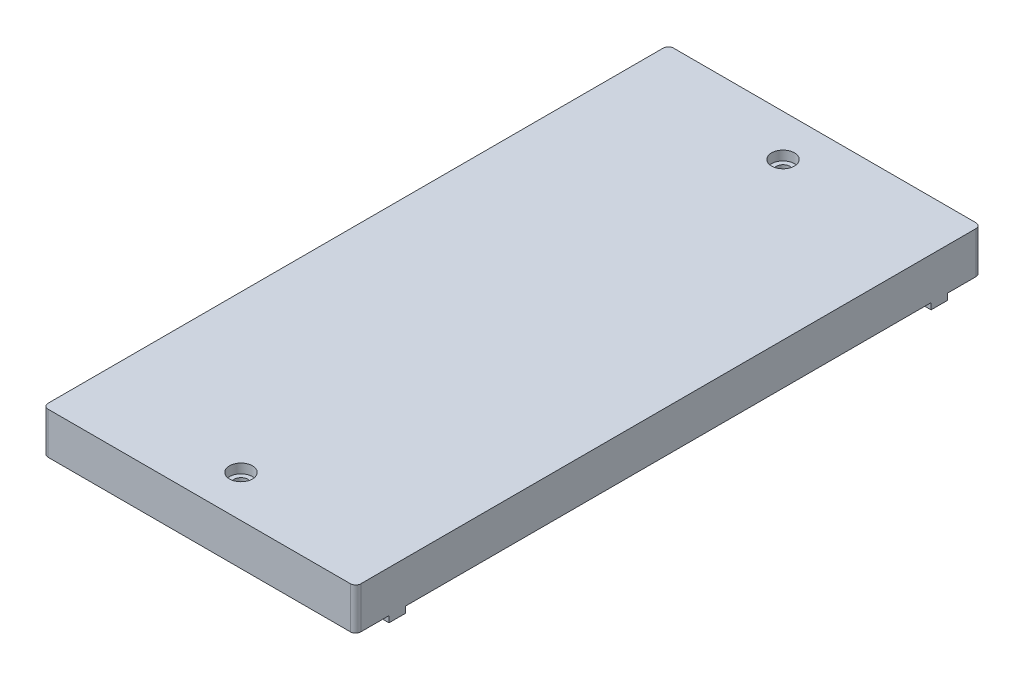
ISO-10303-21;
HEADER;
FILE_DESCRIPTION(('STEP AP214'),'2;1');
FILE_NAME('part.step','',(''),(''),'','','');
FILE_SCHEMA(('AUTOMOTIVE_DESIGN { 1 0 10303 214 1 1 1 1 }'));
ENDSEC;
DATA;
#1=APPLICATION_CONTEXT('core data for automotive mechanical design processes');
#2=APPLICATION_PROTOCOL_DEFINITION('international standard','automotive_design',2000,#1);
#3=PRODUCT_CONTEXT('',#1,'mechanical');
#4=PRODUCT('Part','Part','',(#3));
#5=PRODUCT_RELATED_PRODUCT_CATEGORY('part','',(#4));
#6=PRODUCT_DEFINITION_FORMATION('','',#4);
#7=PRODUCT_DEFINITION_CONTEXT('part definition',#1,'design');
#8=PRODUCT_DEFINITION('design','',#6,#7);
#9=PRODUCT_DEFINITION_SHAPE('','',#8);
#10=(LENGTH_UNIT() NAMED_UNIT(*) SI_UNIT(.MILLI.,.METRE.));
#11=(NAMED_UNIT(*) PLANE_ANGLE_UNIT() SI_UNIT($,.RADIAN.));
#12=(NAMED_UNIT(*) SI_UNIT($,.STERADIAN.) SOLID_ANGLE_UNIT());
#13=UNCERTAINTY_MEASURE_WITH_UNIT(LENGTH_MEASURE(1.E-05),#10,'distance_accuracy_value','');
#14=(GEOMETRIC_REPRESENTATION_CONTEXT(3) GLOBAL_UNCERTAINTY_ASSIGNED_CONTEXT((#13)) GLOBAL_UNIT_ASSIGNED_CONTEXT((#10,
#11,#12)) REPRESENTATION_CONTEXT('',''));
#15=CARTESIAN_POINT('',(0.,0.,0.));
#16=DIRECTION('',(0.,0.,1.));
#17=DIRECTION('',(1.,0.,0.));
#18=AXIS2_PLACEMENT_3D('',#15,#16,#17);
#19=CARTESIAN_POINT('',(0.,0.,0.));
#20=DIRECTION('',(0.,1.,0.));
#21=DIRECTION('',(0.,0.,1.));
#22=AXIS2_PLACEMENT_3D('',#19,#20,#21);
#23=PLANE('',#22);
#24=DIRECTION('',(0.,0.,1.));
#25=VECTOR('',#24,1.);
#26=CARTESIAN_POINT('',(-75.,0.,150.));
#27=LINE('',#26,#25);
#28=CARTESIAN_POINT('',(-75.,0.,-126.));
#29=VERTEX_POINT('',#28);
#30=CARTESIAN_POINT('',(-75.,0.,126.));
#31=VERTEX_POINT('',#30);
#32=EDGE_CURVE('E244',#29,#31,#27,.T.);
#33=ORIENTED_EDGE('',*,*,#32,.F.);
#34=DIRECTION('',(1.,0.,0.));
#35=VECTOR('',#34,1.);
#36=CARTESIAN_POINT('',(75.0000000000001,0.,-126.));
#37=LINE('',#36,#35);
#38=CARTESIAN_POINT('',(75.0000000000001,0.,-126.));
#39=VERTEX_POINT('',#38);
#40=EDGE_CURVE('E182',#29,#39,#37,.T.);
#41=ORIENTED_EDGE('',*,*,#40,.T.);
#42=DIRECTION('',(0.,0.,-1.));
#43=VECTOR('',#42,1.);
#44=CARTESIAN_POINT('',(75.0000000000001,0.,150.));
#45=LINE('',#44,#43);
#46=CARTESIAN_POINT('',(75.0000000000001,0.,126.));
#47=VERTEX_POINT('',#46);
#48=EDGE_CURVE('E249',#47,#39,#45,.T.);
#49=ORIENTED_EDGE('',*,*,#48,.F.);
#50=DIRECTION('',(-1.,0.,0.));
#51=VECTOR('',#50,1.);
#52=CARTESIAN_POINT('',(-75.,0.,126.));
#53=LINE('',#52,#51);
#54=EDGE_CURVE('E203',#47,#31,#53,.T.);
#55=ORIENTED_EDGE('',*,*,#54,.T.);
#56=EDGE_LOOP('',(#33,#41,#49,#55));
#57=FACE_BOUND('',#56,.T.);
#58=ADVANCED_FACE('F43',(#57),#23,.F.);
#59=DIRECTION('',(1.,0.,0.));
#60=VECTOR('',#59,1.);
#61=CARTESIAN_POINT('',(75.0000000000001,0.,150.));
#62=LINE('',#61,#60);
#63=CARTESIAN_POINT('',(-72.5,0.,150.));
#64=VERTEX_POINT('',#63);
#65=CARTESIAN_POINT('',(72.5000000000001,0.,150.));
#66=VERTEX_POINT('',#65);
#67=EDGE_CURVE('E243',#64,#66,#62,.T.);
#68=ORIENTED_EDGE('',*,*,#67,.F.);
#69=CARTESIAN_POINT('',(-72.5,0.,147.5));
#70=DIRECTION('',(0.,1.,0.));
#71=DIRECTION('',(0.,0.,1.));
#72=AXIS2_PLACEMENT_3D('',#69,#70,#71);
#73=CIRCLE('',#72,2.5);
#74=CARTESIAN_POINT('',(-75.,0.,147.5));
#75=VERTEX_POINT('',#74);
#76=EDGE_CURVE('E11',#64,#75,#73,.F.);
#77=ORIENTED_EDGE('',*,*,#76,.T.);
#78=CARTESIAN_POINT('',(-75.,0.,134.));
#79=VERTEX_POINT('',#78);
#80=EDGE_CURVE('E220',#79,#75,#27,.T.);
#81=ORIENTED_EDGE('',*,*,#80,.F.);
#82=DIRECTION('',(1.,0.,0.));
#83=VECTOR('',#82,1.);
#84=CARTESIAN_POINT('',(-75.,0.,134.));
#85=LINE('',#84,#83);
#86=CARTESIAN_POINT('',(75.0000000000001,0.,134.));
#87=VERTEX_POINT('',#86);
#88=EDGE_CURVE('E195',#79,#87,#85,.T.);
#89=ORIENTED_EDGE('',*,*,#88,.T.);
#90=CARTESIAN_POINT('',(75.0000000000001,0.,147.5));
#91=VERTEX_POINT('',#90);
#92=EDGE_CURVE('E247',#91,#87,#45,.T.);
#93=ORIENTED_EDGE('',*,*,#92,.F.);
#94=CARTESIAN_POINT('',(72.5000000000001,0.,147.5));
#95=DIRECTION('',(0.,1.,0.));
#96=DIRECTION('',(0.,0.,1.));
#97=AXIS2_PLACEMENT_3D('',#94,#95,#96);
#98=CIRCLE('',#97,2.5);
#99=EDGE_CURVE('E51',#91,#66,#98,.F.);
#100=ORIENTED_EDGE('',*,*,#99,.T.);
#101=EDGE_LOOP('',(#68,#77,#81,#89,#93,#100));
#102=FACE_BOUND('',#101,.T.);
#103=ADVANCED_FACE('F293',(#102),#23,.F.);
#104=CARTESIAN_POINT('',(-75.,20.,150.));
#105=DIRECTION('',(1.,0.,0.));
#106=DIRECTION('',(0.,0.,-1.));
#107=AXIS2_PLACEMENT_3D('',#104,#105,#106);
#108=PLANE('',#107);
#109=CARTESIAN_POINT('',(-75.,10.,0.));
#110=DIRECTION('',(-1.,0.,0.));
#111=DIRECTION('',(0.,0.,1.));
#112=AXIS2_PLACEMENT_3D('',#109,#110,#111);
#113=CIRCLE('',#112,3.39999999999999);
#114=CARTESIAN_POINT('',(-75.,10.,3.39999999999999));
#115=VERTEX_POINT('',#114);
#116=EDGE_CURVE('E418',#115,#115,#113,.T.);
#117=ORIENTED_EDGE('',*,*,#116,.F.);
#118=EDGE_LOOP('',(#117));
#119=FACE_BOUND('',#118,.T.);
#120=DIRECTION('',(0.,0.,1.));
#121=VECTOR('',#120,1.);
#122=CARTESIAN_POINT('',(-75.,20.,150.));
#123=LINE('',#122,#121);
#124=CARTESIAN_POINT('',(-75.,20.,-147.5));
#125=VERTEX_POINT('',#124);
#126=CARTESIAN_POINT('',(-75.,20.,147.5));
#127=VERTEX_POINT('',#126);
#128=EDGE_CURVE('E227',#125,#127,#123,.T.);
#129=ORIENTED_EDGE('',*,*,#128,.F.);
#130=DIRECTION('',(0.,-1.,0.));
#131=VECTOR('',#130,1.);
#132=CARTESIAN_POINT('',(-75.,20.,-147.5));
#133=LINE('',#132,#131);
#134=CARTESIAN_POINT('',(-75.,0.,-147.5));
#135=VERTEX_POINT('',#134);
#136=EDGE_CURVE('E282',#125,#135,#133,.T.);
#137=ORIENTED_EDGE('',*,*,#136,.T.);
#138=CARTESIAN_POINT('',(-75.,0.,-134.));
#139=VERTEX_POINT('',#138);
#140=EDGE_CURVE('E241',#135,#139,#27,.T.);
#141=ORIENTED_EDGE('',*,*,#140,.T.);
#142=DIRECTION('',(0.,1.,0.));
#143=VECTOR('',#142,1.);
#144=CARTESIAN_POINT('',(-75.,-3.,-134.));
#145=LINE('',#144,#143);
#146=CARTESIAN_POINT('',(-75.,-3.,-134.));
#147=VERTEX_POINT('',#146);
#148=EDGE_CURVE('E166',#147,#139,#145,.T.);
#149=ORIENTED_EDGE('',*,*,#148,.F.);
#150=DIRECTION('',(0.,0.,1.));
#151=VECTOR('',#150,1.);
#152=CARTESIAN_POINT('',(-75.,-3.,-134.));
#153=LINE('',#152,#151);
#154=CARTESIAN_POINT('',(-75.,-3.,-126.));
#155=VERTEX_POINT('',#154);
#156=EDGE_CURVE('E177',#147,#155,#153,.T.);
#157=ORIENTED_EDGE('',*,*,#156,.T.);
#158=DIRECTION('',(0.,1.,0.));
#159=VECTOR('',#158,1.);
#160=CARTESIAN_POINT('',(-75.,-3.,-126.));
#161=LINE('',#160,#159);
#162=EDGE_CURVE('E196',#155,#29,#161,.T.);
#163=ORIENTED_EDGE('',*,*,#162,.T.);
#164=ORIENTED_EDGE('',*,*,#32,.T.);
#165=DIRECTION('',(0.,1.,0.));
#166=VECTOR('',#165,1.);
#167=CARTESIAN_POINT('',(-75.,-3.,126.));
#168=LINE('',#167,#166);
#169=CARTESIAN_POINT('',(-75.,-3.,126.));
#170=VERTEX_POINT('',#169);
#171=EDGE_CURVE('E217',#170,#31,#168,.T.);
#172=ORIENTED_EDGE('',*,*,#171,.F.);
#173=DIRECTION('',(0.,0.,1.));
#174=VECTOR('',#173,1.);
#175=CARTESIAN_POINT('',(-75.,-3.,134.));
#176=LINE('',#175,#174);
#177=CARTESIAN_POINT('',(-75.,-3.,134.));
#178=VERTEX_POINT('',#177);
#179=EDGE_CURVE('E199',#170,#178,#176,.T.);
#180=ORIENTED_EDGE('',*,*,#179,.T.);
#181=DIRECTION('',(0.,1.,0.));
#182=VECTOR('',#181,1.);
#183=CARTESIAN_POINT('',(-75.,-3.,134.));
#184=LINE('',#183,#182);
#185=EDGE_CURVE('E212',#178,#79,#184,.T.);
#186=ORIENTED_EDGE('',*,*,#185,.T.);
#187=ORIENTED_EDGE('',*,*,#80,.T.);
#188=DIRECTION('',(0.,-1.,0.));
#189=VECTOR('',#188,1.);
#190=CARTESIAN_POINT('',(-75.,20.,147.5));
#191=LINE('',#190,#189);
#192=EDGE_CURVE('E280',#75,#127,#191,.F.);
#193=ORIENTED_EDGE('',*,*,#192,.T.);
#194=EDGE_LOOP('',(#129,#137,#141,#149,#157,#163,#164,#172,#180,#186,#187,#193));
#195=FACE_BOUND('',#194,.T.);
#196=ADVANCED_FACE('F298',(#119,#195),#108,.F.);
#197=CARTESIAN_POINT('',(75.0000000000001,20.,150.));
#198=DIRECTION('',(0.,0.,-1.));
#199=DIRECTION('',(-1.,0.,0.));
#200=AXIS2_PLACEMENT_3D('',#197,#198,#199);
#201=PLANE('',#200);
#202=DIRECTION('',(1.,0.,0.));
#203=VECTOR('',#202,1.);
#204=CARTESIAN_POINT('',(75.0000000000001,20.,150.));
#205=LINE('',#204,#203);
#206=CARTESIAN_POINT('',(-72.5,20.,150.));
#207=VERTEX_POINT('',#206);
#208=CARTESIAN_POINT('',(72.5000000000001,20.,150.));
#209=VERTEX_POINT('',#208);
#210=EDGE_CURVE('E230',#207,#209,#205,.T.);
#211=ORIENTED_EDGE('',*,*,#210,.F.);
#212=DIRECTION('',(0.,-1.,0.));
#213=VECTOR('',#212,1.);
#214=CARTESIAN_POINT('',(-72.5,20.,150.));
#215=LINE('',#214,#213);
#216=EDGE_CURVE('E287',#207,#64,#215,.T.);
#217=ORIENTED_EDGE('',*,*,#216,.T.);
#218=ORIENTED_EDGE('',*,*,#67,.T.);
#219=DIRECTION('',(0.,-1.,0.));
#220=VECTOR('',#219,1.);
#221=CARTESIAN_POINT('',(72.5000000000001,20.,150.));
#222=LINE('',#221,#220);
#223=EDGE_CURVE('E285',#66,#209,#222,.F.);
#224=ORIENTED_EDGE('',*,*,#223,.T.);
#225=EDGE_LOOP('',(#211,#217,#218,#224));
#226=FACE_BOUND('',#225,.T.);
#227=ADVANCED_FACE('F290',(#226),#201,.F.);
#228=CARTESIAN_POINT('',(75.0000000000001,20.,150.));
#229=DIRECTION('',(-1.,0.,0.));
#230=DIRECTION('',(0.,0.,1.));
#231=AXIS2_PLACEMENT_3D('',#228,#229,#230);
#232=PLANE('',#231);
#233=CARTESIAN_POINT('',(75.0000000000001,0.,-134.));
#234=VERTEX_POINT('',#233);
#235=CARTESIAN_POINT('',(75.0000000000001,0.,-147.5));
#236=VERTEX_POINT('',#235);
#237=EDGE_CURVE('E246',#234,#236,#45,.T.);
#238=ORIENTED_EDGE('',*,*,#237,.T.);
#239=DIRECTION('',(0.,-1.,0.));
#240=VECTOR('',#239,1.);
#241=CARTESIAN_POINT('',(75.0000000000001,20.,-147.5));
#242=LINE('',#241,#240);
#243=CARTESIAN_POINT('',(75.0000000000001,20.,-147.5));
#244=VERTEX_POINT('',#243);
#245=EDGE_CURVE('E270',#236,#244,#242,.F.);
#246=ORIENTED_EDGE('',*,*,#245,.T.);
#247=DIRECTION('',(0.,0.,-1.));
#248=VECTOR('',#247,1.);
#249=CARTESIAN_POINT('',(75.0000000000001,20.,150.));
#250=LINE('',#249,#248);
#251=CARTESIAN_POINT('',(75.0000000000001,20.,147.5));
#252=VERTEX_POINT('',#251);
#253=EDGE_CURVE('E234',#252,#244,#250,.T.);
#254=ORIENTED_EDGE('',*,*,#253,.F.);
#255=DIRECTION('',(0.,-1.,0.));
#256=VECTOR('',#255,1.);
#257=CARTESIAN_POINT('',(75.0000000000001,20.,147.5));
#258=LINE('',#257,#256);
#259=EDGE_CURVE('E267',#252,#91,#258,.T.);
#260=ORIENTED_EDGE('',*,*,#259,.T.);
#261=ORIENTED_EDGE('',*,*,#92,.T.);
#262=DIRECTION('',(0.,1.,0.));
#263=VECTOR('',#262,1.);
#264=CARTESIAN_POINT('',(75.0000000000001,-3.,134.));
#265=LINE('',#264,#263);
#266=CARTESIAN_POINT('',(75.0000000000001,-3.,134.));
#267=VERTEX_POINT('',#266);
#268=EDGE_CURVE('E223',#267,#87,#265,.T.);
#269=ORIENTED_EDGE('',*,*,#268,.F.);
#270=DIRECTION('',(0.,0.,-1.));
#271=VECTOR('',#270,1.);
#272=CARTESIAN_POINT('',(75.0000000000001,-3.,134.));
#273=LINE('',#272,#271);
#274=CARTESIAN_POINT('',(75.0000000000001,-3.,126.));
#275=VERTEX_POINT('',#274);
#276=EDGE_CURVE('E206',#267,#275,#273,.T.);
#277=ORIENTED_EDGE('',*,*,#276,.T.);
#278=DIRECTION('',(0.,1.,0.));
#279=VECTOR('',#278,1.);
#280=CARTESIAN_POINT('',(75.0000000000001,-3.,126.));
#281=LINE('',#280,#279);
#282=EDGE_CURVE('E221',#275,#47,#281,.T.);
#283=ORIENTED_EDGE('',*,*,#282,.T.);
#284=ORIENTED_EDGE('',*,*,#48,.T.);
#285=DIRECTION('',(0.,1.,0.));
#286=VECTOR('',#285,1.);
#287=CARTESIAN_POINT('',(75.0000000000001,-3.,-126.));
#288=LINE('',#287,#286);
#289=CARTESIAN_POINT('',(75.0000000000001,-3.,-126.));
#290=VERTEX_POINT('',#289);
#291=EDGE_CURVE('E181',#290,#39,#288,.T.);
#292=ORIENTED_EDGE('',*,*,#291,.F.);
#293=DIRECTION('',(0.,0.,-1.));
#294=VECTOR('',#293,1.);
#295=CARTESIAN_POINT('',(75.0000000000001,-3.,-134.));
#296=LINE('',#295,#294);
#297=CARTESIAN_POINT('',(75.0000000000001,-3.,-134.));
#298=VERTEX_POINT('',#297);
#299=EDGE_CURVE('E174',#290,#298,#296,.T.);
#300=ORIENTED_EDGE('',*,*,#299,.T.);
#301=DIRECTION('',(0.,1.,0.));
#302=VECTOR('',#301,1.);
#303=CARTESIAN_POINT('',(75.0000000000001,-3.,-134.));
#304=LINE('',#303,#302);
#305=EDGE_CURVE('E155',#298,#234,#304,.T.);
#306=ORIENTED_EDGE('',*,*,#305,.T.);
#307=EDGE_LOOP('',(#238,#246,#254,#260,#261,#269,#277,#283,#284,#292,#300,#306));
#308=FACE_BOUND('',#307,.T.);
#309=ADVANCED_FACE('F179',(#308),#232,.F.);
#310=CARTESIAN_POINT('',(75.0000000000001,20.,-150.));
#311=DIRECTION('',(0.,0.,1.));
#312=DIRECTION('',(1.,0.,0.));
#313=AXIS2_PLACEMENT_3D('',#310,#311,#312);
#314=PLANE('',#313);
#315=DIRECTION('',(-1.,0.,0.));
#316=VECTOR('',#315,1.);
#317=CARTESIAN_POINT('',(75.0000000000001,20.,-150.));
#318=LINE('',#317,#316);
#319=CARTESIAN_POINT('',(72.5000000000001,20.,-150.));
#320=VERTEX_POINT('',#319);
#321=CARTESIAN_POINT('',(-72.5,20.,-150.));
#322=VERTEX_POINT('',#321);
#323=EDGE_CURVE('E237',#320,#322,#318,.T.);
#324=ORIENTED_EDGE('',*,*,#323,.F.);
#325=DIRECTION('',(0.,-1.,0.));
#326=VECTOR('',#325,1.);
#327=CARTESIAN_POINT('',(72.5000000000001,20.,-150.));
#328=LINE('',#327,#326);
#329=CARTESIAN_POINT('',(72.5000000000001,0.,-150.));
#330=VERTEX_POINT('',#329);
#331=EDGE_CURVE('E260',#320,#330,#328,.T.);
#332=ORIENTED_EDGE('',*,*,#331,.T.);
#333=DIRECTION('',(-1.,0.,0.));
#334=VECTOR('',#333,1.);
#335=CARTESIAN_POINT('',(75.0000000000001,0.,-150.));
#336=LINE('',#335,#334);
#337=CARTESIAN_POINT('',(-72.5,0.,-150.));
#338=VERTEX_POINT('',#337);
#339=EDGE_CURVE('E231',#330,#338,#336,.T.);
#340=ORIENTED_EDGE('',*,*,#339,.T.);
#341=DIRECTION('',(0.,-1.,0.));
#342=VECTOR('',#341,1.);
#343=CARTESIAN_POINT('',(-72.5,20.,-150.));
#344=LINE('',#343,#342);
#345=EDGE_CURVE('E240',#338,#322,#344,.F.);
#346=ORIENTED_EDGE('',*,*,#345,.T.);
#347=EDGE_LOOP('',(#324,#332,#340,#346));
#348=FACE_BOUND('',#347,.T.);
#349=ADVANCED_FACE('F315',(#348),#314,.F.);
#350=CARTESIAN_POINT('',(0.,20.,0.));
#351=DIRECTION('',(0.,1.,0.));
#352=DIRECTION('',(0.,0.,1.));
#353=AXIS2_PLACEMENT_3D('',#350,#351,#352);
#354=PLANE('',#353);
#355=CARTESIAN_POINT('',(0.,20.,130.));
#356=DIRECTION('',(0.,1.,0.));
#357=DIRECTION('',(0.,0.,1.));
#358=AXIS2_PLACEMENT_3D('',#355,#356,#357);
#359=CIRCLE('',#358,5.5);
#360=CARTESIAN_POINT('',(0.,20.,135.5));
#361=VERTEX_POINT('',#360);
#362=EDGE_CURVE('E421',#361,#361,#359,.T.);
#363=ORIENTED_EDGE('',*,*,#362,.F.);
#364=EDGE_LOOP('',(#363));
#365=FACE_BOUND('',#364,.T.);
#366=CARTESIAN_POINT('',(0.,20.,-130.));
#367=DIRECTION('',(0.,1.,0.));
#368=DIRECTION('',(0.,0.,1.));
#369=AXIS2_PLACEMENT_3D('',#366,#367,#368);
#370=CIRCLE('',#369,5.5);
#371=CARTESIAN_POINT('',(0.,20.,-124.5));
#372=VERTEX_POINT('',#371);
#373=EDGE_CURVE('E257',#372,#372,#370,.T.);
#374=ORIENTED_EDGE('',*,*,#373,.F.);
#375=EDGE_LOOP('',(#374));
#376=FACE_BOUND('',#375,.T.);
#377=ORIENTED_EDGE('',*,*,#253,.T.);
#378=CARTESIAN_POINT('',(72.5000000000001,20.,-147.5));
#379=DIRECTION('',(0.,1.,0.));
#380=DIRECTION('',(0.,0.,1.));
#381=AXIS2_PLACEMENT_3D('',#378,#379,#380);
#382=CIRCLE('',#381,2.5);
#383=EDGE_CURVE('E278',#244,#320,#382,.T.);
#384=ORIENTED_EDGE('',*,*,#383,.T.);
#385=ORIENTED_EDGE('',*,*,#323,.T.);
#386=CARTESIAN_POINT('',(-72.5,20.,-147.5));
#387=DIRECTION('',(0.,1.,0.));
#388=DIRECTION('',(0.,0.,1.));
#389=AXIS2_PLACEMENT_3D('',#386,#387,#388);
#390=CIRCLE('',#389,2.5);
#391=EDGE_CURVE('E276',#322,#125,#390,.T.);
#392=ORIENTED_EDGE('',*,*,#391,.T.);
#393=ORIENTED_EDGE('',*,*,#128,.T.);
#394=CARTESIAN_POINT('',(-72.5,20.,147.5));
#395=DIRECTION('',(0.,1.,0.));
#396=DIRECTION('',(0.,0.,1.));
#397=AXIS2_PLACEMENT_3D('',#394,#395,#396);
#398=CIRCLE('',#397,2.5);
#399=EDGE_CURVE('E274',#127,#207,#398,.T.);
#400=ORIENTED_EDGE('',*,*,#399,.T.);
#401=ORIENTED_EDGE('',*,*,#210,.T.);
#402=CARTESIAN_POINT('',(72.5000000000001,20.,147.5));
#403=DIRECTION('',(0.,1.,0.));
#404=DIRECTION('',(0.,0.,1.));
#405=AXIS2_PLACEMENT_3D('',#402,#403,#404);
#406=CIRCLE('',#405,2.5);
#407=EDGE_CURVE('E272',#209,#252,#406,.T.);
#408=ORIENTED_EDGE('',*,*,#407,.T.);
#409=EDGE_LOOP('',(#377,#384,#385,#392,#393,#400,#401,#408));
#410=FACE_BOUND('',#409,.T.);
#411=ADVANCED_FACE('F302',(#365,#376,#410),#354,.T.);
#412=ORIENTED_EDGE('',*,*,#339,.F.);
#413=CARTESIAN_POINT('',(72.5000000000001,0.,-147.5));
#414=DIRECTION('',(0.,1.,0.));
#415=DIRECTION('',(0.,0.,1.));
#416=AXIS2_PLACEMENT_3D('',#413,#414,#415);
#417=CIRCLE('',#416,2.5);
#418=EDGE_CURVE('E265',#330,#236,#417,.F.);
#419=ORIENTED_EDGE('',*,*,#418,.T.);
#420=ORIENTED_EDGE('',*,*,#237,.F.);
#421=DIRECTION('',(-1.,0.,0.));
#422=VECTOR('',#421,1.);
#423=CARTESIAN_POINT('',(75.0000000000001,0.,-134.));
#424=LINE('',#423,#422);
#425=EDGE_CURVE('E161',#234,#139,#424,.T.);
#426=ORIENTED_EDGE('',*,*,#425,.T.);
#427=ORIENTED_EDGE('',*,*,#140,.F.);
#428=CARTESIAN_POINT('',(-72.5,0.,-147.5));
#429=DIRECTION('',(0.,1.,0.));
#430=DIRECTION('',(0.,0.,1.));
#431=AXIS2_PLACEMENT_3D('',#428,#429,#430);
#432=CIRCLE('',#431,2.5);
#433=EDGE_CURVE('E263',#135,#338,#432,.F.);
#434=ORIENTED_EDGE('',*,*,#433,.T.);
#435=EDGE_LOOP('',(#412,#419,#420,#426,#427,#434));
#436=FACE_BOUND('',#435,.T.);
#437=ADVANCED_FACE('F312',(#436),#23,.F.);
#438=CARTESIAN_POINT('',(-75.,-3.,126.));
#439=DIRECTION('',(0.,0.,-1.));
#440=DIRECTION('',(-1.,0.,0.));
#441=AXIS2_PLACEMENT_3D('',#438,#439,#440);
#442=PLANE('',#441);
#443=ORIENTED_EDGE('',*,*,#54,.F.);
#444=ORIENTED_EDGE('',*,*,#282,.F.);
#445=DIRECTION('',(-1.,0.,0.));
#446=VECTOR('',#445,1.);
#447=CARTESIAN_POINT('',(-75.,-3.,126.));
#448=LINE('',#447,#446);
#449=EDGE_CURVE('E209',#275,#170,#448,.T.);
#450=ORIENTED_EDGE('',*,*,#449,.T.);
#451=ORIENTED_EDGE('',*,*,#171,.T.);
#452=EDGE_LOOP('',(#443,#444,#450,#451));
#453=FACE_BOUND('',#452,.T.);
#454=ADVANCED_FACE('F331',(#453),#442,.T.);
#455=CARTESIAN_POINT('',(-75.,-3.,134.));
#456=DIRECTION('',(0.,0.,1.));
#457=DIRECTION('',(1.,0.,0.));
#458=AXIS2_PLACEMENT_3D('',#455,#456,#457);
#459=PLANE('',#458);
#460=ORIENTED_EDGE('',*,*,#88,.F.);
#461=ORIENTED_EDGE('',*,*,#185,.F.);
#462=DIRECTION('',(1.,0.,0.));
#463=VECTOR('',#462,1.);
#464=CARTESIAN_POINT('',(-75.,-3.,134.));
#465=LINE('',#464,#463);
#466=EDGE_CURVE('E202',#178,#267,#465,.T.);
#467=ORIENTED_EDGE('',*,*,#466,.T.);
#468=ORIENTED_EDGE('',*,*,#268,.T.);
#469=EDGE_LOOP('',(#460,#461,#467,#468));
#470=FACE_BOUND('',#469,.T.);
#471=ADVANCED_FACE('F338',(#470),#459,.T.);
#472=CARTESIAN_POINT('',(0.,-3.,0.));
#473=DIRECTION('',(0.,-1.,0.));
#474=DIRECTION('',(0.,0.,-1.));
#475=AXIS2_PLACEMENT_3D('',#472,#473,#474);
#476=PLANE('',#475);
#477=CARTESIAN_POINT('',(0.,-3.,130.));
#478=DIRECTION('',(0.,-1.,0.));
#479=DIRECTION('',(0.,0.,-1.));
#480=AXIS2_PLACEMENT_3D('',#477,#478,#479);
#481=CIRCLE('',#480,3.3);
#482=CARTESIAN_POINT('',(0.,-3.,126.7));
#483=VERTEX_POINT('',#482);
#484=EDGE_CURVE('E254',#483,#483,#481,.T.);
#485=ORIENTED_EDGE('',*,*,#484,.F.);
#486=EDGE_LOOP('',(#485));
#487=FACE_BOUND('',#486,.T.);
#488=ORIENTED_EDGE('',*,*,#179,.F.);
#489=ORIENTED_EDGE('',*,*,#449,.F.);
#490=ORIENTED_EDGE('',*,*,#276,.F.);
#491=ORIENTED_EDGE('',*,*,#466,.F.);
#492=EDGE_LOOP('',(#488,#489,#490,#491));
#493=FACE_BOUND('',#492,.T.);
#494=ADVANCED_FACE('F335',(#487,#493),#476,.T.);
#495=CARTESIAN_POINT('',(75.0000000000001,-3.,-126.));
#496=DIRECTION('',(0.,0.,1.));
#497=DIRECTION('',(1.,0.,0.));
#498=AXIS2_PLACEMENT_3D('',#495,#496,#497);
#499=PLANE('',#498);
#500=ORIENTED_EDGE('',*,*,#40,.F.);
#501=ORIENTED_EDGE('',*,*,#162,.F.);
#502=DIRECTION('',(1.,0.,0.));
#503=VECTOR('',#502,1.);
#504=CARTESIAN_POINT('',(75.0000000000001,-3.,-126.));
#505=LINE('',#504,#503);
#506=EDGE_CURVE('E167',#155,#290,#505,.T.);
#507=ORIENTED_EDGE('',*,*,#506,.T.);
#508=ORIENTED_EDGE('',*,*,#291,.T.);
#509=EDGE_LOOP('',(#500,#501,#507,#508));
#510=FACE_BOUND('',#509,.T.);
#511=ADVANCED_FACE('F328',(#510),#499,.T.);
#512=CARTESIAN_POINT('',(75.0000000000001,-3.,-134.));
#513=DIRECTION('',(0.,0.,-1.));
#514=DIRECTION('',(-1.,0.,0.));
#515=AXIS2_PLACEMENT_3D('',#512,#513,#514);
#516=PLANE('',#515);
#517=ORIENTED_EDGE('',*,*,#425,.F.);
#518=ORIENTED_EDGE('',*,*,#305,.F.);
#519=DIRECTION('',(-1.,0.,0.));
#520=VECTOR('',#519,1.);
#521=CARTESIAN_POINT('',(75.0000000000001,-3.,-134.));
#522=LINE('',#521,#520);
#523=EDGE_CURVE('E159',#298,#147,#522,.T.);
#524=ORIENTED_EDGE('',*,*,#523,.T.);
#525=ORIENTED_EDGE('',*,*,#148,.T.);
#526=EDGE_LOOP('',(#517,#518,#524,#525));
#527=FACE_BOUND('',#526,.T.);
#528=ADVANCED_FACE('F157',(#527),#516,.T.);
#529=CARTESIAN_POINT('',(0.,-3.,0.));
#530=DIRECTION('',(0.,-1.,0.));
#531=DIRECTION('',(0.,0.,-1.));
#532=AXIS2_PLACEMENT_3D('',#529,#530,#531);
#533=PLANE('',#532);
#534=CARTESIAN_POINT('',(0.,-3.,-130.));
#535=DIRECTION('',(0.,-1.,0.));
#536=DIRECTION('',(0.,0.,-1.));
#537=AXIS2_PLACEMENT_3D('',#534,#535,#536);
#538=CIRCLE('',#537,3.3);
#539=CARTESIAN_POINT('',(0.,-3.,-133.3));
#540=VERTEX_POINT('',#539);
#541=EDGE_CURVE('E192',#540,#540,#538,.T.);
#542=ORIENTED_EDGE('',*,*,#541,.F.);
#543=EDGE_LOOP('',(#542));
#544=FACE_BOUND('',#543,.T.);
#545=ORIENTED_EDGE('',*,*,#299,.F.);
#546=ORIENTED_EDGE('',*,*,#506,.F.);
#547=ORIENTED_EDGE('',*,*,#156,.F.);
#548=ORIENTED_EDGE('',*,*,#523,.F.);
#549=EDGE_LOOP('',(#545,#546,#547,#548));
#550=FACE_BOUND('',#549,.T.);
#551=ADVANCED_FACE('F172',(#544,#550),#533,.T.);
#552=CARTESIAN_POINT('',(0.,20.,-130.));
#553=DIRECTION('',(0.,1.,0.));
#554=DIRECTION('',(0.,0.,1.));
#555=AXIS2_PLACEMENT_3D('',#552,#553,#554);
#556=CYLINDRICAL_SURFACE('',#555,3.3);
#557=ORIENTED_EDGE('',*,*,#541,.T.);
#558=EDGE_LOOP('',(#557));
#559=FACE_BOUND('',#558,.T.);
#560=CARTESIAN_POINT('',(0.,15.5,-130.));
#561=DIRECTION('',(0.,1.,0.));
#562=DIRECTION('',(0.,0.,1.));
#563=AXIS2_PLACEMENT_3D('',#560,#561,#562);
#564=CIRCLE('',#563,3.3);
#565=CARTESIAN_POINT('',(0.,15.5,-126.7));
#566=VERTEX_POINT('',#565);
#567=EDGE_CURVE('E187',#566,#566,#564,.T.);
#568=ORIENTED_EDGE('',*,*,#567,.T.);
#569=EDGE_LOOP('',(#568));
#570=FACE_BOUND('',#569,.T.);
#571=ADVANCED_FACE('F376',(#559,#570),#556,.F.);
#572=CARTESIAN_POINT('',(3.3,15.5,-130.));
#573=DIRECTION('',(0.,-1.,0.));
#574=DIRECTION('',(0.,0.,-1.));
#575=AXIS2_PLACEMENT_3D('',#572,#573,#574);
#576=PLANE('',#575);
#577=ORIENTED_EDGE('',*,*,#567,.F.);
#578=EDGE_LOOP('',(#577));
#579=FACE_BOUND('',#578,.T.);
#580=CARTESIAN_POINT('',(0.,15.5,-130.));
#581=DIRECTION('',(0.,1.,0.));
#582=DIRECTION('',(0.,0.,1.));
#583=AXIS2_PLACEMENT_3D('',#580,#581,#582);
#584=CIRCLE('',#583,5.5);
#585=CARTESIAN_POINT('',(0.,15.5,-124.5));
#586=VERTEX_POINT('',#585);
#587=EDGE_CURVE('E432',#586,#586,#584,.T.);
#588=ORIENTED_EDGE('',*,*,#587,.T.);
#589=EDGE_LOOP('',(#588));
#590=FACE_BOUND('',#589,.T.);
#591=ADVANCED_FACE('F380',(#579,#590),#576,.F.);
#592=CARTESIAN_POINT('',(0.,20.,-130.));
#593=DIRECTION('',(0.,1.,0.));
#594=DIRECTION('',(0.,0.,1.));
#595=AXIS2_PLACEMENT_3D('',#592,#593,#594);
#596=CYLINDRICAL_SURFACE('',#595,5.5);
#597=ORIENTED_EDGE('',*,*,#587,.F.);
#598=EDGE_LOOP('',(#597));
#599=FACE_BOUND('',#598,.T.);
#600=ORIENTED_EDGE('',*,*,#373,.T.);
#601=EDGE_LOOP('',(#600));
#602=FACE_BOUND('',#601,.T.);
#603=ADVANCED_FACE('F384',(#599,#602),#596,.F.);
#604=CARTESIAN_POINT('',(0.,20.,130.));
#605=DIRECTION('',(0.,1.,0.));
#606=DIRECTION('',(0.,0.,1.));
#607=AXIS2_PLACEMENT_3D('',#604,#605,#606);
#608=CYLINDRICAL_SURFACE('',#607,3.3);
#609=ORIENTED_EDGE('',*,*,#484,.T.);
#610=EDGE_LOOP('',(#609));
#611=FACE_BOUND('',#610,.T.);
#612=CARTESIAN_POINT('',(0.,15.5,130.));
#613=DIRECTION('',(0.,1.,0.));
#614=DIRECTION('',(0.,0.,1.));
#615=AXIS2_PLACEMENT_3D('',#612,#613,#614);
#616=CIRCLE('',#615,3.3);
#617=CARTESIAN_POINT('',(0.,15.5,133.3));
#618=VERTEX_POINT('',#617);
#619=EDGE_CURVE('E258',#618,#618,#616,.T.);
#620=ORIENTED_EDGE('',*,*,#619,.T.);
#621=EDGE_LOOP('',(#620));
#622=FACE_BOUND('',#621,.T.);
#623=ADVANCED_FACE('F388',(#611,#622),#608,.F.);
#624=CARTESIAN_POINT('',(3.3,15.5,130.));
#625=DIRECTION('',(0.,-1.,0.));
#626=DIRECTION('',(0.,0.,-1.));
#627=AXIS2_PLACEMENT_3D('',#624,#625,#626);
#628=PLANE('',#627);
#629=ORIENTED_EDGE('',*,*,#619,.F.);
#630=EDGE_LOOP('',(#629));
#631=FACE_BOUND('',#630,.T.);
#632=CARTESIAN_POINT('',(0.,15.5,130.));
#633=DIRECTION('',(0.,1.,0.));
#634=DIRECTION('',(0.,0.,1.));
#635=AXIS2_PLACEMENT_3D('',#632,#633,#634);
#636=CIRCLE('',#635,5.5);
#637=CARTESIAN_POINT('',(0.,15.5,135.5));
#638=VERTEX_POINT('',#637);
#639=EDGE_CURVE('E426',#638,#638,#636,.T.);
#640=ORIENTED_EDGE('',*,*,#639,.T.);
#641=EDGE_LOOP('',(#640));
#642=FACE_BOUND('',#641,.T.);
#643=ADVANCED_FACE('F392',(#631,#642),#628,.F.);
#644=CARTESIAN_POINT('',(0.,20.,130.));
#645=DIRECTION('',(0.,1.,0.));
#646=DIRECTION('',(0.,0.,1.));
#647=AXIS2_PLACEMENT_3D('',#644,#645,#646);
#648=CYLINDRICAL_SURFACE('',#647,5.5);
#649=ORIENTED_EDGE('',*,*,#639,.F.);
#650=EDGE_LOOP('',(#649));
#651=FACE_BOUND('',#650,.T.);
#652=ORIENTED_EDGE('',*,*,#362,.T.);
#653=EDGE_LOOP('',(#652));
#654=FACE_BOUND('',#653,.T.);
#655=ADVANCED_FACE('F396',(#651,#654),#648,.F.);
#656=CARTESIAN_POINT('',(-41.25,9.99999999999999,0.));
#657=DIRECTION('',(1.,0.,0.));
#658=DIRECTION('',(0.,0.,-1.));
#659=AXIS2_PLACEMENT_3D('',#656,#657,#658);
#660=PLANE('',#659);
#661=CARTESIAN_POINT('',(-41.25,10.,0.));
#662=DIRECTION('',(-1.,0.,0.));
#663=DIRECTION('',(0.,0.,1.));
#664=AXIS2_PLACEMENT_3D('',#661,#662,#663);
#665=CIRCLE('',#664,3.39999999999999);
#666=CARTESIAN_POINT('',(-41.25,10.,3.39999999999999));
#667=VERTEX_POINT('',#666);
#668=EDGE_CURVE('E415',#667,#667,#665,.T.);
#669=ORIENTED_EDGE('',*,*,#668,.T.);
#670=EDGE_LOOP('',(#669));
#671=FACE_BOUND('',#670,.T.);
#672=ADVANCED_FACE('F400',(#671),#660,.F.);
#673=CARTESIAN_POINT('',(-75.,10.,0.));
#674=DIRECTION('',(-1.,0.,0.));
#675=DIRECTION('',(0.,0.,1.));
#676=AXIS2_PLACEMENT_3D('',#673,#674,#675);
#677=CYLINDRICAL_SURFACE('',#676,3.39999999999999);
#678=ORIENTED_EDGE('',*,*,#668,.F.);
#679=EDGE_LOOP('',(#678));
#680=FACE_BOUND('',#679,.T.);
#681=ORIENTED_EDGE('',*,*,#116,.T.);
#682=EDGE_LOOP('',(#681));
#683=FACE_BOUND('',#682,.T.);
#684=ADVANCED_FACE('F404',(#680,#683),#677,.F.);
#685=CARTESIAN_POINT('',(72.5000000000001,20.,-147.5));
#686=DIRECTION('',(0.,-1.,0.));
#687=DIRECTION('',(0.,0.,-1.));
#688=AXIS2_PLACEMENT_3D('',#685,#686,#687);
#689=CYLINDRICAL_SURFACE('',#688,2.5);
#690=ORIENTED_EDGE('',*,*,#383,.F.);
#691=ORIENTED_EDGE('',*,*,#245,.F.);
#692=ORIENTED_EDGE('',*,*,#418,.F.);
#693=ORIENTED_EDGE('',*,*,#331,.F.);
#694=EDGE_LOOP('',(#690,#691,#692,#693));
#695=FACE_BOUND('',#694,.T.);
#696=ADVANCED_FACE('F319',(#695),#689,.T.);
#697=CARTESIAN_POINT('',(-72.5,20.,-147.5));
#698=DIRECTION('',(0.,-1.,0.));
#699=DIRECTION('',(0.,0.,-1.));
#700=AXIS2_PLACEMENT_3D('',#697,#698,#699);
#701=CYLINDRICAL_SURFACE('',#700,2.5);
#702=ORIENTED_EDGE('',*,*,#391,.F.);
#703=ORIENTED_EDGE('',*,*,#345,.F.);
#704=ORIENTED_EDGE('',*,*,#433,.F.);
#705=ORIENTED_EDGE('',*,*,#136,.F.);
#706=EDGE_LOOP('',(#702,#703,#704,#705));
#707=FACE_BOUND('',#706,.T.);
#708=ADVANCED_FACE('F308',(#707),#701,.T.);
#709=CARTESIAN_POINT('',(-72.5,20.,147.5));
#710=DIRECTION('',(0.,-1.,0.));
#711=DIRECTION('',(0.,0.,-1.));
#712=AXIS2_PLACEMENT_3D('',#709,#710,#711);
#713=CYLINDRICAL_SURFACE('',#712,2.5);
#714=ORIENTED_EDGE('',*,*,#399,.F.);
#715=ORIENTED_EDGE('',*,*,#192,.F.);
#716=ORIENTED_EDGE('',*,*,#76,.F.);
#717=ORIENTED_EDGE('',*,*,#216,.F.);
#718=EDGE_LOOP('',(#714,#715,#716,#717));
#719=FACE_BOUND('',#718,.T.);
#720=ADVANCED_FACE('F300',(#719),#713,.T.);
#721=CARTESIAN_POINT('',(72.5000000000001,20.,147.5));
#722=DIRECTION('',(0.,-1.,0.));
#723=DIRECTION('',(0.,0.,-1.));
#724=AXIS2_PLACEMENT_3D('',#721,#722,#723);
#725=CYLINDRICAL_SURFACE('',#724,2.5);
#726=ORIENTED_EDGE('',*,*,#407,.F.);
#727=ORIENTED_EDGE('',*,*,#223,.F.);
#728=ORIENTED_EDGE('',*,*,#99,.F.);
#729=ORIENTED_EDGE('',*,*,#259,.F.);
#730=EDGE_LOOP('',(#726,#727,#728,#729));
#731=FACE_BOUND('',#730,.T.);
#732=ADVANCED_FACE('F45',(#731),#725,.T.);
#733=CLOSED_SHELL('',(#58,#103,#196,#227,#309,#349,#411,#437,#454,#471,#494,#511,#528,#551,#571,
#591,#603,#623,#643,#655,#672,#684,#696,#708,#720,#732));
#734=MANIFOLD_SOLID_BREP('B2',#733);
#735=ADVANCED_BREP_SHAPE_REPRESENTATION('',(#18,#734),#14);
#736=SHAPE_DEFINITION_REPRESENTATION(#9,#735);
ENDSEC;
END-ISO-10303-21;
